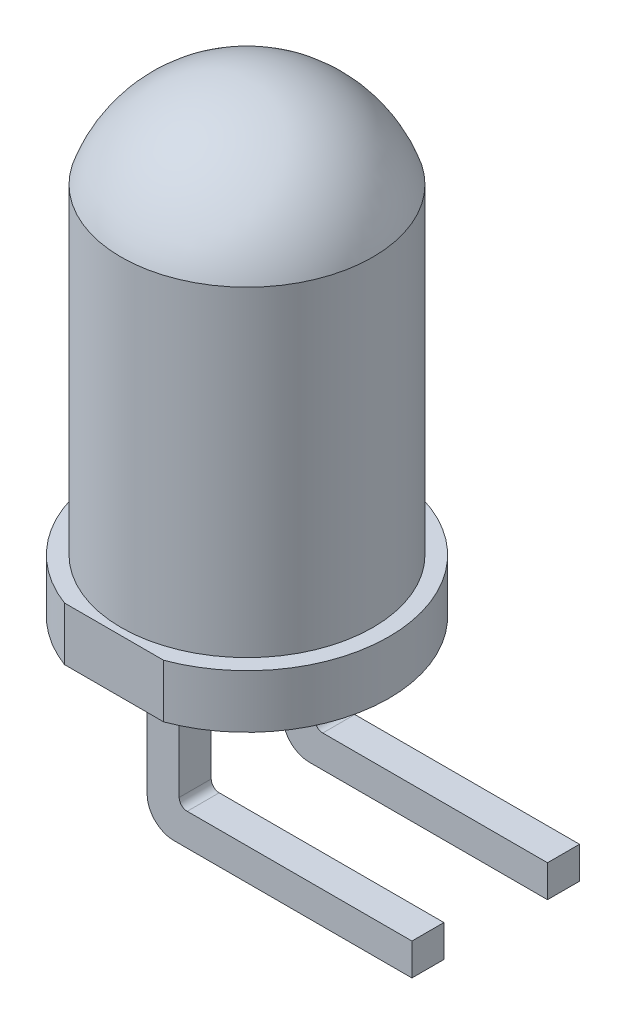
ISO-10303-21;
HEADER;
FILE_DESCRIPTION(('STEP AP214'),'2;1');
FILE_NAME('part.step','',(''),(''),'','','');
FILE_SCHEMA(('AUTOMOTIVE_DESIGN { 1 0 10303 214 1 1 1 1 }'));
ENDSEC;
DATA;
#1=APPLICATION_CONTEXT('core data for automotive mechanical design processes');
#2=APPLICATION_PROTOCOL_DEFINITION('international standard','automotive_design',2000,#1);
#3=PRODUCT_CONTEXT('',#1,'mechanical');
#4=PRODUCT('Part','Part','',(#3));
#5=PRODUCT_RELATED_PRODUCT_CATEGORY('part','',(#4));
#6=PRODUCT_DEFINITION_FORMATION('','',#4);
#7=PRODUCT_DEFINITION_CONTEXT('part definition',#1,'design');
#8=PRODUCT_DEFINITION('design','',#6,#7);
#9=PRODUCT_DEFINITION_SHAPE('','',#8);
#10=(LENGTH_UNIT() NAMED_UNIT(*) SI_UNIT(.MILLI.,.METRE.));
#11=(NAMED_UNIT(*) PLANE_ANGLE_UNIT() SI_UNIT($,.RADIAN.));
#12=(NAMED_UNIT(*) SI_UNIT($,.STERADIAN.) SOLID_ANGLE_UNIT());
#13=UNCERTAINTY_MEASURE_WITH_UNIT(LENGTH_MEASURE(1.E-05),#10,'distance_accuracy_value','');
#14=(GEOMETRIC_REPRESENTATION_CONTEXT(3) GLOBAL_UNCERTAINTY_ASSIGNED_CONTEXT((#13)) GLOBAL_UNIT_ASSIGNED_CONTEXT((#10,
#11,#12)) REPRESENTATION_CONTEXT('',''));
#15=CARTESIAN_POINT('',(0.,0.,0.));
#16=DIRECTION('',(0.,0.,1.));
#17=DIRECTION('',(1.,0.,0.));
#18=AXIS2_PLACEMENT_3D('',#15,#16,#17);
#19=CARTESIAN_POINT('',(0.299999999999999,-2.75,-1.57));
#20=DIRECTION('',(-1.,0.,0.));
#21=DIRECTION('',(0.,-1.,0.));
#22=AXIS2_PLACEMENT_3D('',#19,#20,#21);
#23=PLANE('',#22);
#24=DIRECTION('',(0.,1.,0.));
#25=VECTOR('',#24,1.);
#26=CARTESIAN_POINT('',(0.299999999999999,-2.75,-0.97));
#27=LINE('',#26,#25);
#28=CARTESIAN_POINT('',(0.299999999999999,-2.,-0.97));
#29=VERTEX_POINT('',#28);
#30=CARTESIAN_POINT('',(0.3,0.,-0.97));
#31=VERTEX_POINT('',#30);
#32=EDGE_CURVE('E251',#29,#31,#27,.T.);
#33=ORIENTED_EDGE('',*,*,#32,.F.);
#34=DIRECTION('',(0.,0.,1.));
#35=VECTOR('',#34,1.);
#36=CARTESIAN_POINT('',(0.299999999999999,-2.,-1.57));
#37=LINE('',#36,#35);
#38=CARTESIAN_POINT('',(0.299999999999999,-2.,-1.57));
#39=VERTEX_POINT('',#38);
#40=EDGE_CURVE('E351',#29,#39,#37,.F.);
#41=ORIENTED_EDGE('',*,*,#40,.T.);
#42=DIRECTION('',(0.,1.,0.));
#43=VECTOR('',#42,1.);
#44=CARTESIAN_POINT('',(0.299999999999999,-2.75,-1.57));
#45=LINE('',#44,#43);
#46=CARTESIAN_POINT('',(0.3,0.,-1.57));
#47=VERTEX_POINT('',#46);
#48=EDGE_CURVE('E254',#39,#47,#45,.T.);
#49=ORIENTED_EDGE('',*,*,#48,.T.);
#50=DIRECTION('',(0.,0.,1.));
#51=VECTOR('',#50,1.);
#52=CARTESIAN_POINT('',(0.3,0.,-1.57));
#53=LINE('',#52,#51);
#54=EDGE_CURVE('E242',#47,#31,#53,.T.);
#55=ORIENTED_EDGE('',*,*,#54,.T.);
#56=EDGE_LOOP('',(#33,#41,#49,#55));
#57=FACE_BOUND('',#56,.T.);
#58=ADVANCED_FACE('F43',(#57),#23,.F.);
#59=CARTESIAN_POINT('',(0.299999999999999,-2.75,1.57));
#60=DIRECTION('',(-1.,0.,0.));
#61=DIRECTION('',(0.,-1.,0.));
#62=AXIS2_PLACEMENT_3D('',#59,#60,#61);
#63=PLANE('',#62);
#64=DIRECTION('',(0.,1.,0.));
#65=VECTOR('',#64,1.);
#66=CARTESIAN_POINT('',(0.299999999999999,-2.75,1.57));
#67=LINE('',#66,#65);
#68=CARTESIAN_POINT('',(0.299999999999999,-2.,1.57));
#69=VERTEX_POINT('',#68);
#70=CARTESIAN_POINT('',(0.3,0.,1.57));
#71=VERTEX_POINT('',#70);
#72=EDGE_CURVE('E286',#69,#71,#67,.T.);
#73=ORIENTED_EDGE('',*,*,#72,.F.);
#74=DIRECTION('',(0.,0.,1.));
#75=VECTOR('',#74,1.);
#76=CARTESIAN_POINT('',(0.299999999999999,-2.,0.97));
#77=LINE('',#76,#75);
#78=CARTESIAN_POINT('',(0.299999999999999,-2.,0.97));
#79=VERTEX_POINT('',#78);
#80=EDGE_CURVE('E65',#69,#79,#77,.F.);
#81=ORIENTED_EDGE('',*,*,#80,.T.);
#82=DIRECTION('',(0.,1.,0.));
#83=VECTOR('',#82,1.);
#84=CARTESIAN_POINT('',(0.299999999999999,-2.75,0.97));
#85=LINE('',#84,#83);
#86=CARTESIAN_POINT('',(0.3,0.,0.97));
#87=VERTEX_POINT('',#86);
#88=EDGE_CURVE('E289',#79,#87,#85,.T.);
#89=ORIENTED_EDGE('',*,*,#88,.T.);
#90=DIRECTION('',(0.,0.,1.));
#91=VECTOR('',#90,1.);
#92=CARTESIAN_POINT('',(0.3,0.,1.57));
#93=LINE('',#92,#91);
#94=EDGE_CURVE('E277',#87,#71,#93,.T.);
#95=ORIENTED_EDGE('',*,*,#94,.T.);
#96=EDGE_LOOP('',(#73,#81,#89,#95));
#97=FACE_BOUND('',#96,.T.);
#98=ADVANCED_FACE('F392',(#97),#63,.F.);
#99=CARTESIAN_POINT('',(0.,0.,0.));
#100=DIRECTION('',(0.,-1.,0.));
#101=DIRECTION('',(1.,0.,0.));
#102=AXIS2_PLACEMENT_3D('',#99,#100,#101);
#103=PLANE('',#102);
#104=DIRECTION('',(1.,0.,0.));
#105=VECTOR('',#104,1.);
#106=CARTESIAN_POINT('',(-0.929941857044273,0.,2.49));
#107=LINE('',#106,#105);
#108=CARTESIAN_POINT('',(-0.929941857044273,0.,2.49));
#109=VERTEX_POINT('',#108);
#110=CARTESIAN_POINT('',(0.929941857044271,0.,2.49));
#111=VERTEX_POINT('',#110);
#112=EDGE_CURVE('E295',#109,#111,#107,.T.);
#113=ORIENTED_EDGE('',*,*,#112,.F.);
#114=CARTESIAN_POINT('',(0.,0.,0.));
#115=DIRECTION('',(0.,1.,0.));
#116=DIRECTION('',(-1.,0.,0.));
#117=AXIS2_PLACEMENT_3D('',#114,#115,#116);
#118=CIRCLE('',#117,2.65798642913822);
#119=EDGE_CURVE('E316',#111,#109,#118,.T.);
#120=ORIENTED_EDGE('',*,*,#119,.F.);
#121=EDGE_LOOP('',(#113,#120));
#122=FACE_BOUND('',#121,.T.);
#123=DIRECTION('',(1.,0.,0.));
#124=VECTOR('',#123,1.);
#125=CARTESIAN_POINT('',(0.3,0.,0.97));
#126=LINE('',#125,#124);
#127=CARTESIAN_POINT('',(-0.3,0.,0.97));
#128=VERTEX_POINT('',#127);
#129=EDGE_CURVE('E273',#128,#87,#126,.T.);
#130=ORIENTED_EDGE('',*,*,#129,.F.);
#131=DIRECTION('',(0.,0.,-1.));
#132=VECTOR('',#131,1.);
#133=CARTESIAN_POINT('',(-0.3,0.,1.57));
#134=LINE('',#133,#132);
#135=CARTESIAN_POINT('',(-0.3,0.,1.57));
#136=VERTEX_POINT('',#135);
#137=EDGE_CURVE('E260',#136,#128,#134,.T.);
#138=ORIENTED_EDGE('',*,*,#137,.F.);
#139=DIRECTION('',(-1.,0.,0.));
#140=VECTOR('',#139,1.);
#141=CARTESIAN_POINT('',(0.3,0.,1.57));
#142=LINE('',#141,#140);
#143=EDGE_CURVE('E265',#71,#136,#142,.T.);
#144=ORIENTED_EDGE('',*,*,#143,.F.);
#145=ORIENTED_EDGE('',*,*,#94,.F.);
#146=EDGE_LOOP('',(#130,#138,#144,#145));
#147=FACE_BOUND('',#146,.T.);
#148=DIRECTION('',(1.,0.,0.));
#149=VECTOR('',#148,1.);
#150=CARTESIAN_POINT('',(0.3,0.,-1.57));
#151=LINE('',#150,#149);
#152=CARTESIAN_POINT('',(-0.3,0.,-1.57));
#153=VERTEX_POINT('',#152);
#154=EDGE_CURVE('E238',#153,#47,#151,.T.);
#155=ORIENTED_EDGE('',*,*,#154,.F.);
#156=DIRECTION('',(0.,0.,-1.));
#157=VECTOR('',#156,1.);
#158=CARTESIAN_POINT('',(-0.3,0.,-1.57));
#159=LINE('',#158,#157);
#160=CARTESIAN_POINT('',(-0.3,0.,-0.97));
#161=VERTEX_POINT('',#160);
#162=EDGE_CURVE('E231',#161,#153,#159,.T.);
#163=ORIENTED_EDGE('',*,*,#162,.F.);
#164=DIRECTION('',(-1.,0.,0.));
#165=VECTOR('',#164,1.);
#166=CARTESIAN_POINT('',(0.3,0.,-0.97));
#167=LINE('',#166,#165);
#168=EDGE_CURVE('E233',#31,#161,#167,.T.);
#169=ORIENTED_EDGE('',*,*,#168,.F.);
#170=ORIENTED_EDGE('',*,*,#54,.F.);
#171=EDGE_LOOP('',(#155,#163,#169,#170));
#172=FACE_BOUND('',#171,.T.);
#173=ADVANCED_FACE('F398',(#122,#147,#172),#103,.T.);
#174=CARTESIAN_POINT('',(0.,6.21,0.));
#175=DIRECTION('',(0.,1.,0.));
#176=DIRECTION('',(-1.,0.,0.));
#177=AXIS2_PLACEMENT_3D('',#174,#175,#176);
#178=SPHERICAL_SURFACE('',#177,2.49);
#179=CARTESIAN_POINT('',(0.,7.01,0.));
#180=DIRECTION('',(0.,1.,0.));
#181=DIRECTION('',(-1.,0.,0.));
#182=AXIS2_PLACEMENT_3D('',#179,#180,#181);
#183=CIRCLE('',#182,2.35798642913822);
#184=CARTESIAN_POINT('',(-2.35798642913822,7.01,0.));
#185=VERTEX_POINT('',#184);
#186=EDGE_CURVE('E304',#185,#185,#183,.T.);
#187=ORIENTED_EDGE('',*,*,#186,.T.);
#188=EDGE_LOOP('',(#187));
#189=FACE_BOUND('',#188,.T.);
#190=ADVANCED_FACE('F439',(#189),#178,.T.);
#191=CARTESIAN_POINT('',(0.,8.7,0.));
#192=DIRECTION('',(0.,1.,0.));
#193=DIRECTION('',(-1.,0.,0.));
#194=AXIS2_PLACEMENT_3D('',#191,#192,#193);
#195=CYLINDRICAL_SURFACE('',#194,2.65798642913822);
#196=DIRECTION('',(0.,-1.,0.));
#197=VECTOR('',#196,1.);
#198=CARTESIAN_POINT('',(-0.929941857044269,10.,2.49));
#199=LINE('',#198,#197);
#200=CARTESIAN_POINT('',(-0.929941857044273,1.,2.49));
#201=VERTEX_POINT('',#200);
#202=EDGE_CURVE('E298',#201,#109,#199,.T.);
#203=ORIENTED_EDGE('',*,*,#202,.F.);
#204=CARTESIAN_POINT('',(0.,1.,0.));
#205=DIRECTION('',(0.,1.,0.));
#206=DIRECTION('',(-1.,0.,0.));
#207=AXIS2_PLACEMENT_3D('',#204,#205,#206);
#208=CIRCLE('',#207,2.65798642913822);
#209=CARTESIAN_POINT('',(0.929941857044272,1.,2.49));
#210=VERTEX_POINT('',#209);
#211=EDGE_CURVE('E312',#210,#201,#208,.T.);
#212=ORIENTED_EDGE('',*,*,#211,.F.);
#213=DIRECTION('',(0.,1.,0.));
#214=VECTOR('',#213,1.);
#215=CARTESIAN_POINT('',(0.929941857044275,8.7,2.49));
#216=LINE('',#215,#214);
#217=EDGE_CURVE('E301',#111,#210,#216,.T.);
#218=ORIENTED_EDGE('',*,*,#217,.F.);
#219=ORIENTED_EDGE('',*,*,#119,.T.);
#220=EDGE_LOOP('',(#203,#212,#218,#219));
#221=FACE_BOUND('',#220,.T.);
#222=ADVANCED_FACE('F435',(#221),#195,.T.);
#223=CARTESIAN_POINT('',(0.,1.,0.));
#224=DIRECTION('',(0.,1.,0.));
#225=DIRECTION('',(-1.,0.,0.));
#226=AXIS2_PLACEMENT_3D('',#223,#224,#225);
#227=PLANE('',#226);
#228=DIRECTION('',(-1.,0.,0.));
#229=VECTOR('',#228,1.);
#230=CARTESIAN_POINT('',(0.,1.,2.49));
#231=LINE('',#230,#229);
#232=EDGE_CURVE('E320',#210,#201,#231,.T.);
#233=ORIENTED_EDGE('',*,*,#232,.F.);
#234=ORIENTED_EDGE('',*,*,#211,.T.);
#235=EDGE_LOOP('',(#233,#234));
#236=FACE_BOUND('',#235,.T.);
#237=CARTESIAN_POINT('',(0.,1.,0.));
#238=DIRECTION('',(0.,1.,0.));
#239=DIRECTION('',(-1.,0.,0.));
#240=AXIS2_PLACEMENT_3D('',#237,#238,#239);
#241=CIRCLE('',#240,2.35798642913822);
#242=CARTESIAN_POINT('',(-2.35798642913822,1.,0.));
#243=VERTEX_POINT('',#242);
#244=EDGE_CURVE('E308',#243,#243,#241,.T.);
#245=ORIENTED_EDGE('',*,*,#244,.F.);
#246=EDGE_LOOP('',(#245));
#247=FACE_BOUND('',#246,.T.);
#248=ADVANCED_FACE('F431',(#236,#247),#227,.T.);
#249=CARTESIAN_POINT('',(0.,8.7,0.));
#250=DIRECTION('',(0.,1.,0.));
#251=DIRECTION('',(-1.,0.,0.));
#252=AXIS2_PLACEMENT_3D('',#249,#250,#251);
#253=CYLINDRICAL_SURFACE('',#252,2.35798642913822);
#254=ORIENTED_EDGE('',*,*,#244,.T.);
#255=EDGE_LOOP('',(#254));
#256=FACE_BOUND('',#255,.T.);
#257=ORIENTED_EDGE('',*,*,#186,.F.);
#258=EDGE_LOOP('',(#257));
#259=FACE_BOUND('',#258,.T.);
#260=ADVANCED_FACE('F427',(#256,#259),#253,.T.);
#261=CARTESIAN_POINT('',(-0.929941857044269,10.,2.49));
#262=DIRECTION('',(0.,0.,-1.));
#263=DIRECTION('',(-1.,0.,0.));
#264=AXIS2_PLACEMENT_3D('',#261,#262,#263);
#265=PLANE('',#264);
#266=ORIENTED_EDGE('',*,*,#217,.T.);
#267=ORIENTED_EDGE('',*,*,#232,.T.);
#268=ORIENTED_EDGE('',*,*,#202,.T.);
#269=ORIENTED_EDGE('',*,*,#112,.T.);
#270=EDGE_LOOP('',(#266,#267,#268,#269));
#271=FACE_BOUND('',#270,.T.);
#272=ADVANCED_FACE('F423',(#271),#265,.F.);
#273=CARTESIAN_POINT('',(-0.300000000000001,-2.75,1.57));
#274=DIRECTION('',(1.,0.,0.));
#275=DIRECTION('',(0.,1.,0.));
#276=AXIS2_PLACEMENT_3D('',#273,#274,#275);
#277=PLANE('',#276);
#278=DIRECTION('',(0.,1.,0.));
#279=VECTOR('',#278,1.);
#280=CARTESIAN_POINT('',(-0.300000000000001,-2.75,0.97));
#281=LINE('',#280,#279);
#282=CARTESIAN_POINT('',(-0.300000000000001,-2.25,0.97));
#283=VERTEX_POINT('',#282);
#284=EDGE_CURVE('E292',#283,#128,#281,.T.);
#285=ORIENTED_EDGE('',*,*,#284,.F.);
#286=DIRECTION('',(0.,0.,-1.));
#287=VECTOR('',#286,1.);
#288=CARTESIAN_POINT('',(-0.300000000000001,-2.25,1.57));
#289=LINE('',#288,#287);
#290=CARTESIAN_POINT('',(-0.300000000000001,-2.25,1.57));
#291=VERTEX_POINT('',#290);
#292=EDGE_CURVE('E330',#283,#291,#289,.F.);
#293=ORIENTED_EDGE('',*,*,#292,.T.);
#294=DIRECTION('',(0.,1.,0.));
#295=VECTOR('',#294,1.);
#296=CARTESIAN_POINT('',(-0.300000000000001,-2.75,1.57));
#297=LINE('',#296,#295);
#298=EDGE_CURVE('E269',#291,#136,#297,.T.);
#299=ORIENTED_EDGE('',*,*,#298,.T.);
#300=ORIENTED_EDGE('',*,*,#137,.T.);
#301=EDGE_LOOP('',(#285,#293,#299,#300));
#302=FACE_BOUND('',#301,.T.);
#303=ADVANCED_FACE('F420',(#302),#277,.F.);
#304=CARTESIAN_POINT('',(0.299999999999999,-2.75,0.97));
#305=DIRECTION('',(0.,0.,1.));
#306=DIRECTION('',(1.,0.,0.));
#307=AXIS2_PLACEMENT_3D('',#304,#305,#306);
#308=PLANE('',#307);
#309=DIRECTION('',(1.,0.,0.));
#310=VECTOR('',#309,1.);
#311=CARTESIAN_POINT('',(0.299999999999999,-2.75,0.97));
#312=LINE('',#311,#310);
#313=CARTESIAN_POINT('',(0.199999999999999,-2.75,0.97));
#314=VERTEX_POINT('',#313);
#315=CARTESIAN_POINT('',(4.66,-2.75,0.970000000000001));
#316=VERTEX_POINT('',#315);
#317=EDGE_CURVE('E261',#314,#316,#312,.T.);
#318=ORIENTED_EDGE('',*,*,#317,.F.);
#319=CARTESIAN_POINT('',(0.199999999999999,-2.25,0.97));
#320=DIRECTION('',(0.,0.,1.));
#321=DIRECTION('',(1.,0.,0.));
#322=AXIS2_PLACEMENT_3D('',#319,#320,#321);
#323=CIRCLE('',#322,0.5);
#324=EDGE_CURVE('E327',#314,#283,#323,.F.);
#325=ORIENTED_EDGE('',*,*,#324,.T.);
#326=ORIENTED_EDGE('',*,*,#284,.T.);
#327=ORIENTED_EDGE('',*,*,#129,.T.);
#328=ORIENTED_EDGE('',*,*,#88,.F.);
#329=CARTESIAN_POINT('',(0.449999999999999,-2.,0.97));
#330=DIRECTION('',(0.,0.,1.));
#331=DIRECTION('',(1.,0.,0.));
#332=AXIS2_PLACEMENT_3D('',#329,#330,#331);
#333=CIRCLE('',#332,0.15);
#334=CARTESIAN_POINT('',(0.449999999999999,-2.15,0.97));
#335=VERTEX_POINT('',#334);
#336=EDGE_CURVE('E11',#79,#335,#333,.T.);
#337=ORIENTED_EDGE('',*,*,#336,.T.);
#338=DIRECTION('',(-1.,0.,0.));
#339=VECTOR('',#338,1.);
#340=CARTESIAN_POINT('',(4.66,-2.15,0.970000000000001));
#341=LINE('',#340,#339);
#342=CARTESIAN_POINT('',(4.66,-2.15,0.970000000000001));
#343=VERTEX_POINT('',#342);
#344=EDGE_CURVE('E227',#343,#335,#341,.T.);
#345=ORIENTED_EDGE('',*,*,#344,.F.);
#346=DIRECTION('',(0.,1.,0.));
#347=VECTOR('',#346,1.);
#348=CARTESIAN_POINT('',(4.66,-2.75,0.970000000000001));
#349=LINE('',#348,#347);
#350=EDGE_CURVE('E218',#316,#343,#349,.T.);
#351=ORIENTED_EDGE('',*,*,#350,.F.);
#352=EDGE_LOOP('',(#318,#325,#326,#327,#328,#337,#345,#351));
#353=FACE_BOUND('',#352,.T.);
#354=ADVANCED_FACE('F383',(#353),#308,.F.);
#355=CARTESIAN_POINT('',(0.299999999999999,-2.75,1.57));
#356=DIRECTION('',(0.,0.,-1.));
#357=DIRECTION('',(-1.,0.,0.));
#358=AXIS2_PLACEMENT_3D('',#355,#356,#357);
#359=PLANE('',#358);
#360=ORIENTED_EDGE('',*,*,#298,.F.);
#361=CARTESIAN_POINT('',(0.199999999999999,-2.25,1.57));
#362=DIRECTION('',(0.,0.,-1.));
#363=DIRECTION('',(-1.,0.,0.));
#364=AXIS2_PLACEMENT_3D('',#361,#362,#363);
#365=CIRCLE('',#364,0.5);
#366=CARTESIAN_POINT('',(0.199999999999999,-2.75,1.57));
#367=VERTEX_POINT('',#366);
#368=EDGE_CURVE('E333',#291,#367,#365,.F.);
#369=ORIENTED_EDGE('',*,*,#368,.T.);
#370=DIRECTION('',(-1.,0.,0.));
#371=VECTOR('',#370,1.);
#372=CARTESIAN_POINT('',(0.299999999999999,-2.75,1.57));
#373=LINE('',#372,#371);
#374=CARTESIAN_POINT('',(4.66,-2.75,1.57));
#375=VERTEX_POINT('',#374);
#376=EDGE_CURVE('E264',#375,#367,#373,.T.);
#377=ORIENTED_EDGE('',*,*,#376,.F.);
#378=DIRECTION('',(0.,-1.,0.));
#379=VECTOR('',#378,1.);
#380=CARTESIAN_POINT('',(4.66,-2.75,1.57));
#381=LINE('',#380,#379);
#382=CARTESIAN_POINT('',(4.66,-2.15,1.57));
#383=VERTEX_POINT('',#382);
#384=EDGE_CURVE('E210',#383,#375,#381,.T.);
#385=ORIENTED_EDGE('',*,*,#384,.F.);
#386=DIRECTION('',(-1.,0.,0.));
#387=VECTOR('',#386,1.);
#388=CARTESIAN_POINT('',(4.66,-2.15,1.57));
#389=LINE('',#388,#387);
#390=CARTESIAN_POINT('',(0.449999999999999,-2.15,1.57));
#391=VERTEX_POINT('',#390);
#392=EDGE_CURVE('E224',#383,#391,#389,.T.);
#393=ORIENTED_EDGE('',*,*,#392,.T.);
#394=CARTESIAN_POINT('',(0.449999999999999,-2.,1.57));
#395=DIRECTION('',(0.,0.,-1.));
#396=DIRECTION('',(-1.,0.,0.));
#397=AXIS2_PLACEMENT_3D('',#394,#395,#396);
#398=CIRCLE('',#397,0.15);
#399=EDGE_CURVE('E52',#391,#69,#398,.T.);
#400=ORIENTED_EDGE('',*,*,#399,.T.);
#401=ORIENTED_EDGE('',*,*,#72,.T.);
#402=ORIENTED_EDGE('',*,*,#143,.T.);
#403=EDGE_LOOP('',(#360,#369,#377,#385,#393,#400,#401,#402));
#404=FACE_BOUND('',#403,.T.);
#405=ADVANCED_FACE('F376',(#404),#359,.F.);
#406=CARTESIAN_POINT('',(0.,-2.75,0.));
#407=DIRECTION('',(0.,1.,0.));
#408=DIRECTION('',(-1.,0.,0.));
#409=AXIS2_PLACEMENT_3D('',#406,#407,#408);
#410=PLANE('',#409);
#411=ORIENTED_EDGE('',*,*,#376,.T.);
#412=DIRECTION('',(0.,0.,-1.));
#413=VECTOR('',#412,1.);
#414=CARTESIAN_POINT('',(0.199999999999999,-2.75,0.));
#415=LINE('',#414,#413);
#416=EDGE_CURVE('E323',#367,#314,#415,.T.);
#417=ORIENTED_EDGE('',*,*,#416,.T.);
#418=ORIENTED_EDGE('',*,*,#317,.T.);
#419=DIRECTION('',(0.,0.,-1.));
#420=VECTOR('',#419,1.);
#421=CARTESIAN_POINT('',(4.66,-2.75,1.57));
#422=LINE('',#421,#420);
#423=EDGE_CURVE('E214',#375,#316,#422,.T.);
#424=ORIENTED_EDGE('',*,*,#423,.F.);
#425=EDGE_LOOP('',(#411,#417,#418,#424));
#426=FACE_BOUND('',#425,.T.);
#427=ADVANCED_FACE('F411',(#426),#410,.F.);
#428=CARTESIAN_POINT('',(-0.300000000000001,-2.75,-1.57));
#429=DIRECTION('',(1.,0.,0.));
#430=DIRECTION('',(0.,1.,0.));
#431=AXIS2_PLACEMENT_3D('',#428,#429,#430);
#432=PLANE('',#431);
#433=DIRECTION('',(0.,1.,0.));
#434=VECTOR('',#433,1.);
#435=CARTESIAN_POINT('',(-0.300000000000001,-2.75,-1.57));
#436=LINE('',#435,#434);
#437=CARTESIAN_POINT('',(-0.300000000000001,-2.25,-1.57));
#438=VERTEX_POINT('',#437);
#439=EDGE_CURVE('E257',#438,#153,#436,.T.);
#440=ORIENTED_EDGE('',*,*,#439,.F.);
#441=DIRECTION('',(0.,0.,-1.));
#442=VECTOR('',#441,1.);
#443=CARTESIAN_POINT('',(-0.300000000000001,-2.25,-0.97));
#444=LINE('',#443,#442);
#445=CARTESIAN_POINT('',(-0.300000000000001,-2.25,-0.97));
#446=VERTEX_POINT('',#445);
#447=EDGE_CURVE('E342',#438,#446,#444,.F.);
#448=ORIENTED_EDGE('',*,*,#447,.T.);
#449=DIRECTION('',(0.,1.,0.));
#450=VECTOR('',#449,1.);
#451=CARTESIAN_POINT('',(-0.300000000000001,-2.75,-0.97));
#452=LINE('',#451,#450);
#453=EDGE_CURVE('E180',#446,#161,#452,.T.);
#454=ORIENTED_EDGE('',*,*,#453,.T.);
#455=ORIENTED_EDGE('',*,*,#162,.T.);
#456=EDGE_LOOP('',(#440,#448,#454,#455));
#457=FACE_BOUND('',#456,.T.);
#458=ADVANCED_FACE('F407',(#457),#432,.F.);
#459=CARTESIAN_POINT('',(0.299999999999999,-2.75,-1.57));
#460=DIRECTION('',(0.,0.,1.));
#461=DIRECTION('',(1.,0.,0.));
#462=AXIS2_PLACEMENT_3D('',#459,#460,#461);
#463=PLANE('',#462);
#464=DIRECTION('',(1.,0.,0.));
#465=VECTOR('',#464,1.);
#466=CARTESIAN_POINT('',(0.299999999999999,-2.75,-1.57));
#467=LINE('',#466,#465);
#468=CARTESIAN_POINT('',(0.199999999999999,-2.75,-1.57));
#469=VERTEX_POINT('',#468);
#470=CARTESIAN_POINT('',(4.66,-2.75,-1.57));
#471=VERTEX_POINT('',#470);
#472=EDGE_CURVE('E181',#469,#471,#467,.T.);
#473=ORIENTED_EDGE('',*,*,#472,.F.);
#474=CARTESIAN_POINT('',(0.199999999999999,-2.25,-1.57));
#475=DIRECTION('',(0.,0.,1.));
#476=DIRECTION('',(1.,0.,0.));
#477=AXIS2_PLACEMENT_3D('',#474,#475,#476);
#478=CIRCLE('',#477,0.5);
#479=EDGE_CURVE('E339',#469,#438,#478,.F.);
#480=ORIENTED_EDGE('',*,*,#479,.T.);
#481=ORIENTED_EDGE('',*,*,#439,.T.);
#482=ORIENTED_EDGE('',*,*,#154,.T.);
#483=ORIENTED_EDGE('',*,*,#48,.F.);
#484=CARTESIAN_POINT('',(0.449999999999999,-2.,-1.57));
#485=DIRECTION('',(0.,0.,1.));
#486=DIRECTION('',(1.,0.,0.));
#487=AXIS2_PLACEMENT_3D('',#484,#485,#486);
#488=CIRCLE('',#487,0.15);
#489=CARTESIAN_POINT('',(0.449999999999999,-2.15,-1.57));
#490=VERTEX_POINT('',#489);
#491=EDGE_CURVE('E357',#39,#490,#488,.T.);
#492=ORIENTED_EDGE('',*,*,#491,.T.);
#493=DIRECTION('',(-1.,0.,0.));
#494=VECTOR('',#493,1.);
#495=CARTESIAN_POINT('',(4.66,-2.15,-1.57));
#496=LINE('',#495,#494);
#497=CARTESIAN_POINT('',(4.66,-2.15,-1.57));
#498=VERTEX_POINT('',#497);
#499=EDGE_CURVE('E206',#498,#490,#496,.T.);
#500=ORIENTED_EDGE('',*,*,#499,.F.);
#501=DIRECTION('',(0.,1.,0.));
#502=VECTOR('',#501,1.);
#503=CARTESIAN_POINT('',(4.66,-2.75,-1.57));
#504=LINE('',#503,#502);
#505=EDGE_CURVE('E190',#471,#498,#504,.T.);
#506=ORIENTED_EDGE('',*,*,#505,.F.);
#507=EDGE_LOOP('',(#473,#480,#481,#482,#483,#492,#500,#506));
#508=FACE_BOUND('',#507,.T.);
#509=ADVANCED_FACE('F404',(#508),#463,.F.);
#510=CARTESIAN_POINT('',(0.299999999999999,-2.75,-0.97));
#511=DIRECTION('',(0.,0.,-1.));
#512=DIRECTION('',(-1.,0.,0.));
#513=AXIS2_PLACEMENT_3D('',#510,#511,#512);
#514=PLANE('',#513);
#515=ORIENTED_EDGE('',*,*,#453,.F.);
#516=CARTESIAN_POINT('',(0.199999999999999,-2.25,-0.97));
#517=DIRECTION('',(0.,0.,-1.));
#518=DIRECTION('',(-1.,0.,0.));
#519=AXIS2_PLACEMENT_3D('',#516,#517,#518);
#520=CIRCLE('',#519,0.5);
#521=CARTESIAN_POINT('',(0.199999999999999,-2.75,-0.97));
#522=VERTEX_POINT('',#521);
#523=EDGE_CURVE('E175',#446,#522,#520,.F.);
#524=ORIENTED_EDGE('',*,*,#523,.T.);
#525=DIRECTION('',(-1.,0.,0.));
#526=VECTOR('',#525,1.);
#527=CARTESIAN_POINT('',(0.299999999999999,-2.75,-0.97));
#528=LINE('',#527,#526);
#529=CARTESIAN_POINT('',(4.66,-2.75,-0.969999999999999));
#530=VERTEX_POINT('',#529);
#531=EDGE_CURVE('E167',#530,#522,#528,.T.);
#532=ORIENTED_EDGE('',*,*,#531,.F.);
#533=DIRECTION('',(0.,-1.,0.));
#534=VECTOR('',#533,1.);
#535=CARTESIAN_POINT('',(4.66,-2.75,-0.969999999999999));
#536=LINE('',#535,#534);
#537=CARTESIAN_POINT('',(4.66,-2.15,-0.969999999999999));
#538=VERTEX_POINT('',#537);
#539=EDGE_CURVE('E173',#538,#530,#536,.T.);
#540=ORIENTED_EDGE('',*,*,#539,.F.);
#541=DIRECTION('',(-1.,0.,0.));
#542=VECTOR('',#541,1.);
#543=CARTESIAN_POINT('',(4.66,-2.15,-0.969999999999999));
#544=LINE('',#543,#542);
#545=CARTESIAN_POINT('',(0.449999999999999,-2.15,-0.97));
#546=VERTEX_POINT('',#545);
#547=EDGE_CURVE('E203',#538,#546,#544,.T.);
#548=ORIENTED_EDGE('',*,*,#547,.T.);
#549=CARTESIAN_POINT('',(0.449999999999999,-2.,-0.97));
#550=DIRECTION('',(0.,0.,-1.));
#551=DIRECTION('',(-1.,0.,0.));
#552=AXIS2_PLACEMENT_3D('',#549,#550,#551);
#553=CIRCLE('',#552,0.15);
#554=EDGE_CURVE('E354',#546,#29,#553,.T.);
#555=ORIENTED_EDGE('',*,*,#554,.T.);
#556=ORIENTED_EDGE('',*,*,#32,.T.);
#557=ORIENTED_EDGE('',*,*,#168,.T.);
#558=EDGE_LOOP('',(#515,#524,#532,#540,#548,#555,#556,#557));
#559=FACE_BOUND('',#558,.T.);
#560=ADVANCED_FACE('F170',(#559),#514,.F.);
#561=CARTESIAN_POINT('',(0.,-2.75,0.));
#562=DIRECTION('',(0.,-1.,0.));
#563=DIRECTION('',(1.,0.,0.));
#564=AXIS2_PLACEMENT_3D('',#561,#562,#563);
#565=PLANE('',#564);
#566=ORIENTED_EDGE('',*,*,#531,.T.);
#567=DIRECTION('',(0.,0.,-1.));
#568=VECTOR('',#567,1.);
#569=CARTESIAN_POINT('',(0.199999999999999,-2.75,-1.57));
#570=LINE('',#569,#568);
#571=EDGE_CURVE('E336',#522,#469,#570,.T.);
#572=ORIENTED_EDGE('',*,*,#571,.T.);
#573=ORIENTED_EDGE('',*,*,#472,.T.);
#574=DIRECTION('',(0.,0.,-1.));
#575=VECTOR('',#574,1.);
#576=CARTESIAN_POINT('',(4.66,-2.75,-0.969999999999999));
#577=LINE('',#576,#575);
#578=EDGE_CURVE('E184',#530,#471,#577,.T.);
#579=ORIENTED_EDGE('',*,*,#578,.F.);
#580=EDGE_LOOP('',(#566,#572,#573,#579));
#581=FACE_BOUND('',#580,.T.);
#582=ADVANCED_FACE('F185',(#581),#565,.T.);
#583=CARTESIAN_POINT('',(4.66,-2.15,1.57));
#584=DIRECTION('',(0.,-1.,0.));
#585=DIRECTION('',(1.,0.,0.));
#586=AXIS2_PLACEMENT_3D('',#583,#584,#585);
#587=PLANE('',#586);
#588=ORIENTED_EDGE('',*,*,#344,.T.);
#589=DIRECTION('',(0.,0.,1.));
#590=VECTOR('',#589,1.);
#591=CARTESIAN_POINT('',(0.449999999999999,-2.15,1.57));
#592=LINE('',#591,#590);
#593=EDGE_CURVE('E360',#335,#391,#592,.T.);
#594=ORIENTED_EDGE('',*,*,#593,.T.);
#595=ORIENTED_EDGE('',*,*,#392,.F.);
#596=DIRECTION('',(0.,0.,1.));
#597=VECTOR('',#596,1.);
#598=CARTESIAN_POINT('',(4.66,-2.15,1.57));
#599=LINE('',#598,#597);
#600=EDGE_CURVE('E221',#343,#383,#599,.T.);
#601=ORIENTED_EDGE('',*,*,#600,.F.);
#602=EDGE_LOOP('',(#588,#594,#595,#601));
#603=FACE_BOUND('',#602,.T.);
#604=ADVANCED_FACE('F369',(#603),#587,.F.);
#605=CARTESIAN_POINT('',(4.66,0.,0.));
#606=DIRECTION('',(-1.,0.,0.));
#607=DIRECTION('',(0.,-1.,0.));
#608=AXIS2_PLACEMENT_3D('',#605,#606,#607);
#609=PLANE('',#608);
#610=ORIENTED_EDGE('',*,*,#384,.T.);
#611=ORIENTED_EDGE('',*,*,#423,.T.);
#612=ORIENTED_EDGE('',*,*,#350,.T.);
#613=ORIENTED_EDGE('',*,*,#600,.T.);
#614=EDGE_LOOP('',(#610,#611,#612,#613));
#615=FACE_BOUND('',#614,.T.);
#616=ADVANCED_FACE('F379',(#615),#609,.F.);
#617=CARTESIAN_POINT('',(4.66,-2.15,-0.969999999999999));
#618=DIRECTION('',(0.,-1.,0.));
#619=DIRECTION('',(1.,0.,0.));
#620=AXIS2_PLACEMENT_3D('',#617,#618,#619);
#621=PLANE('',#620);
#622=ORIENTED_EDGE('',*,*,#499,.T.);
#623=DIRECTION('',(0.,0.,1.));
#624=VECTOR('',#623,1.);
#625=CARTESIAN_POINT('',(0.449999999999999,-2.15,-0.97));
#626=LINE('',#625,#624);
#627=EDGE_CURVE('E347',#490,#546,#626,.T.);
#628=ORIENTED_EDGE('',*,*,#627,.T.);
#629=ORIENTED_EDGE('',*,*,#547,.F.);
#630=DIRECTION('',(0.,0.,1.));
#631=VECTOR('',#630,1.);
#632=CARTESIAN_POINT('',(4.66,-2.15,-0.969999999999999));
#633=LINE('',#632,#631);
#634=EDGE_CURVE('E194',#498,#538,#633,.T.);
#635=ORIENTED_EDGE('',*,*,#634,.F.);
#636=EDGE_LOOP('',(#622,#628,#629,#635));
#637=FACE_BOUND('',#636,.T.);
#638=ADVANCED_FACE('F462',(#637),#621,.F.);
#639=CARTESIAN_POINT('',(4.66,0.,0.));
#640=DIRECTION('',(-1.,0.,0.));
#641=DIRECTION('',(0.,-1.,0.));
#642=AXIS2_PLACEMENT_3D('',#639,#640,#641);
#643=PLANE('',#642);
#644=ORIENTED_EDGE('',*,*,#539,.T.);
#645=ORIENTED_EDGE('',*,*,#578,.T.);
#646=ORIENTED_EDGE('',*,*,#505,.T.);
#647=ORIENTED_EDGE('',*,*,#634,.T.);
#648=EDGE_LOOP('',(#644,#645,#646,#647));
#649=FACE_BOUND('',#648,.T.);
#650=ADVANCED_FACE('F192',(#649),#643,.F.);
#651=CARTESIAN_POINT('',(0.199999999999999,-2.25,0.));
#652=DIRECTION('',(0.,0.,-1.));
#653=DIRECTION('',(-1.,0.,0.));
#654=AXIS2_PLACEMENT_3D('',#651,#652,#653);
#655=CYLINDRICAL_SURFACE('',#654,0.5);
#656=ORIENTED_EDGE('',*,*,#368,.F.);
#657=ORIENTED_EDGE('',*,*,#292,.F.);
#658=ORIENTED_EDGE('',*,*,#324,.F.);
#659=ORIENTED_EDGE('',*,*,#416,.F.);
#660=EDGE_LOOP('',(#656,#657,#658,#659));
#661=FACE_BOUND('',#660,.T.);
#662=ADVANCED_FACE('F447',(#661),#655,.T.);
#663=CARTESIAN_POINT('',(0.199999999999999,-2.25,0.));
#664=DIRECTION('',(0.,0.,1.));
#665=DIRECTION('',(1.,0.,0.));
#666=AXIS2_PLACEMENT_3D('',#663,#664,#665);
#667=CYLINDRICAL_SURFACE('',#666,0.5);
#668=ORIENTED_EDGE('',*,*,#523,.F.);
#669=ORIENTED_EDGE('',*,*,#447,.F.);
#670=ORIENTED_EDGE('',*,*,#479,.F.);
#671=ORIENTED_EDGE('',*,*,#571,.F.);
#672=EDGE_LOOP('',(#668,#669,#670,#671));
#673=FACE_BOUND('',#672,.T.);
#674=ADVANCED_FACE('F389',(#673),#667,.T.);
#675=CARTESIAN_POINT('',(0.449999999999999,-2.,-0.969999999999999));
#676=DIRECTION('',(0.,0.,-1.));
#677=DIRECTION('',(0.,1.,0.));
#678=AXIS2_PLACEMENT_3D('',#675,#676,#677);
#679=CYLINDRICAL_SURFACE('',#678,0.15);
#680=ORIENTED_EDGE('',*,*,#491,.F.);
#681=ORIENTED_EDGE('',*,*,#40,.F.);
#682=ORIENTED_EDGE('',*,*,#554,.F.);
#683=ORIENTED_EDGE('',*,*,#627,.F.);
#684=EDGE_LOOP('',(#680,#681,#682,#683));
#685=FACE_BOUND('',#684,.T.);
#686=ADVANCED_FACE('F385',(#685),#679,.F.);
#687=CARTESIAN_POINT('',(0.449999999999999,-2.,1.57));
#688=DIRECTION('',(0.,0.,-1.));
#689=DIRECTION('',(-1.,0.,0.));
#690=AXIS2_PLACEMENT_3D('',#687,#688,#689);
#691=CYLINDRICAL_SURFACE('',#690,0.15);
#692=ORIENTED_EDGE('',*,*,#336,.F.);
#693=ORIENTED_EDGE('',*,*,#80,.F.);
#694=ORIENTED_EDGE('',*,*,#399,.F.);
#695=ORIENTED_EDGE('',*,*,#593,.F.);
#696=EDGE_LOOP('',(#692,#693,#694,#695));
#697=FACE_BOUND('',#696,.T.);
#698=ADVANCED_FACE('F45',(#697),#691,.F.);
#699=CLOSED_SHELL('',(#58,#98,#173,#190,#222,#248,#260,#272,#303,#354,#405,#427,#458,#509,#560,
#582,#604,#616,#638,#650,#662,#674,#686,#698));
#700=MANIFOLD_SOLID_BREP('B2',#699);
#701=ADVANCED_BREP_SHAPE_REPRESENTATION('',(#18,#700),#14);
#702=SHAPE_DEFINITION_REPRESENTATION(#9,#701);
ENDSEC;
END-ISO-10303-21;
